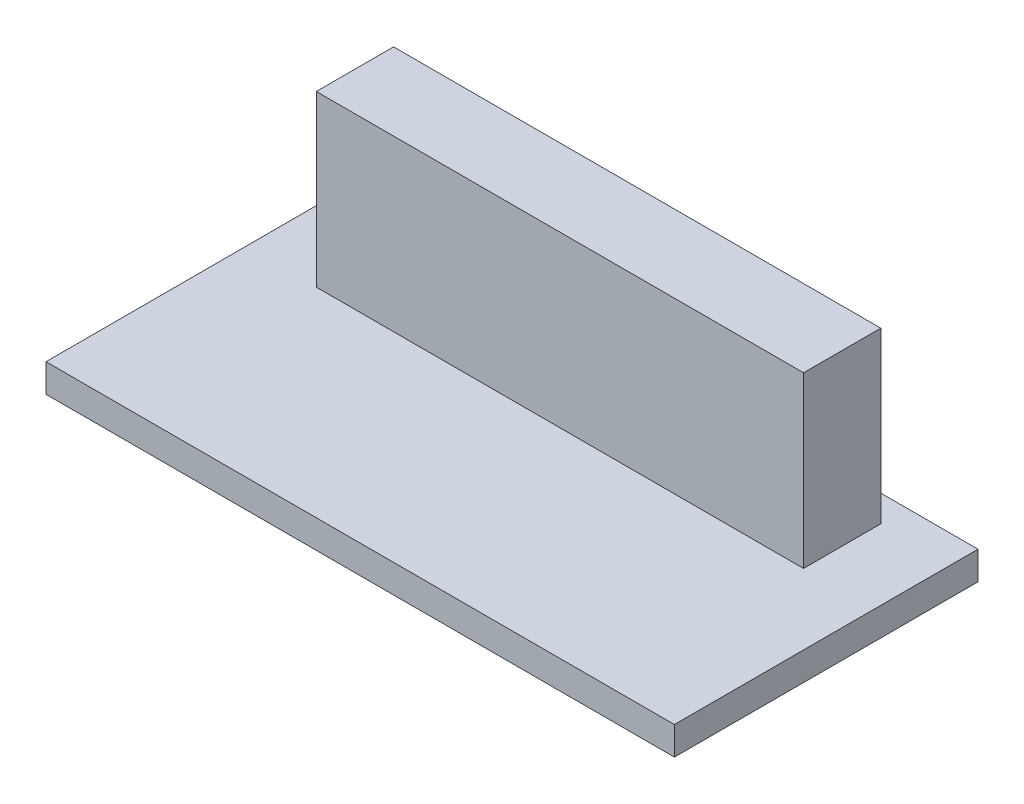
ISO-10303-21;
HEADER;
FILE_DESCRIPTION(('STEP AP214'),'2;1');
FILE_NAME('part.step','',(''),(''),'','','');
FILE_SCHEMA(('AUTOMOTIVE_DESIGN { 1 0 10303 214 1 1 1 1 }'));
ENDSEC;
DATA;
#1=APPLICATION_CONTEXT('core data for automotive mechanical design processes');
#2=APPLICATION_PROTOCOL_DEFINITION('international standard','automotive_design',2000,#1);
#3=PRODUCT_CONTEXT('',#1,'mechanical');
#4=PRODUCT('Part','Part','',(#3));
#5=PRODUCT_RELATED_PRODUCT_CATEGORY('part','',(#4));
#6=PRODUCT_DEFINITION_FORMATION('','',#4);
#7=PRODUCT_DEFINITION_CONTEXT('part definition',#1,'design');
#8=PRODUCT_DEFINITION('design','',#6,#7);
#9=PRODUCT_DEFINITION_SHAPE('','',#8);
#10=(LENGTH_UNIT() NAMED_UNIT(*) SI_UNIT(.MILLI.,.METRE.));
#11=(NAMED_UNIT(*) PLANE_ANGLE_UNIT() SI_UNIT($,.RADIAN.));
#12=(NAMED_UNIT(*) SI_UNIT($,.STERADIAN.) SOLID_ANGLE_UNIT());
#13=UNCERTAINTY_MEASURE_WITH_UNIT(LENGTH_MEASURE(1.E-05),#10,'distance_accuracy_value','');
#14=(GEOMETRIC_REPRESENTATION_CONTEXT(3) GLOBAL_UNCERTAINTY_ASSIGNED_CONTEXT((#13)) GLOBAL_UNIT_ASSIGNED_CONTEXT((#10,
#11,#12)) REPRESENTATION_CONTEXT('',''));
#15=CARTESIAN_POINT('',(0.,0.,0.));
#16=DIRECTION('',(0.,0.,1.));
#17=DIRECTION('',(1.,0.,0.));
#18=AXIS2_PLACEMENT_3D('',#15,#16,#17);
#19=CARTESIAN_POINT('',(0.,2.,0.));
#20=DIRECTION('',(0.,-1.,0.));
#21=DIRECTION('',(0.,0.,-1.));
#22=AXIS2_PLACEMENT_3D('',#19,#20,#21);
#23=PLANE('',#22);
#24=DIRECTION('',(0.,0.,-1.));
#25=VECTOR('',#24,1.);
#26=CARTESIAN_POINT('',(22.25,2.,10.75));
#27=LINE('',#26,#25);
#28=CARTESIAN_POINT('',(22.25,2.,10.75));
#29=VERTEX_POINT('',#28);
#30=CARTESIAN_POINT('',(22.25,2.,-10.75));
#31=VERTEX_POINT('',#30);
#32=EDGE_CURVE('E128',#29,#31,#27,.T.);
#33=ORIENTED_EDGE('',*,*,#32,.T.);
#34=DIRECTION('',(-1.,0.,0.));
#35=VECTOR('',#34,1.);
#36=CARTESIAN_POINT('',(-22.25,2.,-10.75));
#37=LINE('',#36,#35);
#38=CARTESIAN_POINT('',(-22.25,2.,-10.75));
#39=VERTEX_POINT('',#38);
#40=EDGE_CURVE('E131',#31,#39,#37,.T.);
#41=ORIENTED_EDGE('',*,*,#40,.T.);
#42=DIRECTION('',(0.,0.,1.));
#43=VECTOR('',#42,1.);
#44=CARTESIAN_POINT('',(-22.25,2.,10.75));
#45=LINE('',#44,#43);
#46=CARTESIAN_POINT('',(-22.25,2.,10.75));
#47=VERTEX_POINT('',#46);
#48=EDGE_CURVE('E134',#39,#47,#45,.T.);
#49=ORIENTED_EDGE('',*,*,#48,.T.);
#50=DIRECTION('',(1.,0.,0.));
#51=VECTOR('',#50,1.);
#52=CARTESIAN_POINT('',(-22.25,2.,10.75));
#53=LINE('',#52,#51);
#54=EDGE_CURVE('E136',#47,#29,#53,.T.);
#55=ORIENTED_EDGE('',*,*,#54,.T.);
#56=EDGE_LOOP('',(#33,#41,#49,#55));
#57=FACE_BOUND('',#56,.T.);
#58=DIRECTION('',(0.,0.,-1.));
#59=VECTOR('',#58,1.);
#60=CARTESIAN_POINT('',(17.2506231913385,2.,-8.86526866536673));
#61=LINE('',#60,#59);
#62=CARTESIAN_POINT('',(17.2506231913385,2.,-3.39465661527781));
#63=VERTEX_POINT('',#62);
#64=CARTESIAN_POINT('',(17.2506231913385,2.,-8.86526866536673));
#65=VERTEX_POINT('',#64);
#66=EDGE_CURVE('E118',#63,#65,#61,.T.);
#67=ORIENTED_EDGE('',*,*,#66,.F.);
#68=DIRECTION('',(1.,0.,0.));
#69=VECTOR('',#68,1.);
#70=CARTESIAN_POINT('',(-17.2506231913385,2.,-3.39465661527781));
#71=LINE('',#70,#69);
#72=CARTESIAN_POINT('',(-17.2506231913385,2.,-3.39465661527781));
#73=VERTEX_POINT('',#72);
#74=EDGE_CURVE('E115',#73,#63,#71,.T.);
#75=ORIENTED_EDGE('',*,*,#74,.F.);
#76=DIRECTION('',(0.,0.,1.));
#77=VECTOR('',#76,1.);
#78=CARTESIAN_POINT('',(-17.2506231913385,2.,-8.86526866536673));
#79=LINE('',#78,#77);
#80=CARTESIAN_POINT('',(-17.2506231913385,2.,-8.86526866536673));
#81=VERTEX_POINT('',#80);
#82=EDGE_CURVE('E53',#81,#73,#79,.T.);
#83=ORIENTED_EDGE('',*,*,#82,.F.);
#84=DIRECTION('',(-1.,0.,0.));
#85=VECTOR('',#84,1.);
#86=CARTESIAN_POINT('',(-17.2506231913385,2.,-8.86526866536673));
#87=LINE('',#86,#85);
#88=EDGE_CURVE('E48',#65,#81,#87,.T.);
#89=ORIENTED_EDGE('',*,*,#88,.F.);
#90=EDGE_LOOP('',(#67,#75,#83,#89));
#91=FACE_BOUND('',#90,.T.);
#92=ADVANCED_FACE('F33',(#57,#91),#23,.F.);
#93=CARTESIAN_POINT('',(22.25,2.,10.75));
#94=DIRECTION('',(-1.,0.,0.));
#95=DIRECTION('',(0.,0.,1.));
#96=AXIS2_PLACEMENT_3D('',#93,#94,#95);
#97=PLANE('',#96);
#98=DIRECTION('',(0.,0.,-1.));
#99=VECTOR('',#98,1.);
#100=CARTESIAN_POINT('',(22.25,0.,10.75));
#101=LINE('',#100,#99);
#102=CARTESIAN_POINT('',(22.25,0.,10.75));
#103=VERTEX_POINT('',#102);
#104=CARTESIAN_POINT('',(22.25,0.,-10.75));
#105=VERTEX_POINT('',#104);
#106=EDGE_CURVE('E119',#103,#105,#101,.T.);
#107=ORIENTED_EDGE('',*,*,#106,.T.);
#108=DIRECTION('',(0.,-1.,0.));
#109=VECTOR('',#108,1.);
#110=CARTESIAN_POINT('',(22.25,2.,-10.75));
#111=LINE('',#110,#109);
#112=EDGE_CURVE('E11',#31,#105,#111,.T.);
#113=ORIENTED_EDGE('',*,*,#112,.F.);
#114=ORIENTED_EDGE('',*,*,#32,.F.);
#115=DIRECTION('',(0.,-1.,0.));
#116=VECTOR('',#115,1.);
#117=CARTESIAN_POINT('',(22.25,2.,10.75));
#118=LINE('',#117,#116);
#119=EDGE_CURVE('E137',#29,#103,#118,.T.);
#120=ORIENTED_EDGE('',*,*,#119,.T.);
#121=EDGE_LOOP('',(#107,#113,#114,#120));
#122=FACE_BOUND('',#121,.T.);
#123=ADVANCED_FACE('F35',(#122),#97,.F.);
#124=CARTESIAN_POINT('',(-22.25,2.,-10.75));
#125=DIRECTION('',(0.,0.,1.));
#126=DIRECTION('',(1.,0.,0.));
#127=AXIS2_PLACEMENT_3D('',#124,#125,#126);
#128=PLANE('',#127);
#129=DIRECTION('',(-1.,0.,0.));
#130=VECTOR('',#129,1.);
#131=CARTESIAN_POINT('',(-22.25,0.,-10.75));
#132=LINE('',#131,#130);
#133=CARTESIAN_POINT('',(-22.25,0.,-10.75));
#134=VERTEX_POINT('',#133);
#135=EDGE_CURVE('E122',#105,#134,#132,.T.);
#136=ORIENTED_EDGE('',*,*,#135,.T.);
#137=DIRECTION('',(0.,-1.,0.));
#138=VECTOR('',#137,1.);
#139=CARTESIAN_POINT('',(-22.25,2.,-10.75));
#140=LINE('',#139,#138);
#141=EDGE_CURVE('E41',#39,#134,#140,.T.);
#142=ORIENTED_EDGE('',*,*,#141,.F.);
#143=ORIENTED_EDGE('',*,*,#40,.F.);
#144=ORIENTED_EDGE('',*,*,#112,.T.);
#145=EDGE_LOOP('',(#136,#142,#143,#144));
#146=FACE_BOUND('',#145,.T.);
#147=ADVANCED_FACE('F167',(#146),#128,.F.);
#148=CARTESIAN_POINT('',(-22.25,2.,10.75));
#149=DIRECTION('',(1.,0.,0.));
#150=DIRECTION('',(0.,0.,-1.));
#151=AXIS2_PLACEMENT_3D('',#148,#149,#150);
#152=PLANE('',#151);
#153=DIRECTION('',(0.,0.,1.));
#154=VECTOR('',#153,1.);
#155=CARTESIAN_POINT('',(-22.25,0.,10.75));
#156=LINE('',#155,#154);
#157=CARTESIAN_POINT('',(-22.25,0.,10.75));
#158=VERTEX_POINT('',#157);
#159=EDGE_CURVE('E140',#134,#158,#156,.T.);
#160=ORIENTED_EDGE('',*,*,#159,.T.);
#161=DIRECTION('',(0.,-1.,0.));
#162=VECTOR('',#161,1.);
#163=CARTESIAN_POINT('',(-22.25,2.,10.75));
#164=LINE('',#163,#162);
#165=EDGE_CURVE('E145',#47,#158,#164,.T.);
#166=ORIENTED_EDGE('',*,*,#165,.F.);
#167=ORIENTED_EDGE('',*,*,#48,.F.);
#168=ORIENTED_EDGE('',*,*,#141,.T.);
#169=EDGE_LOOP('',(#160,#166,#167,#168));
#170=FACE_BOUND('',#169,.T.);
#171=ADVANCED_FACE('F152',(#170),#152,.F.);
#172=CARTESIAN_POINT('',(-22.25,2.,10.75));
#173=DIRECTION('',(0.,0.,-1.));
#174=DIRECTION('',(-1.,0.,0.));
#175=AXIS2_PLACEMENT_3D('',#172,#173,#174);
#176=PLANE('',#175);
#177=DIRECTION('',(1.,0.,0.));
#178=VECTOR('',#177,1.);
#179=CARTESIAN_POINT('',(-22.25,0.,10.75));
#180=LINE('',#179,#178);
#181=EDGE_CURVE('E132',#158,#103,#180,.T.);
#182=ORIENTED_EDGE('',*,*,#181,.T.);
#183=ORIENTED_EDGE('',*,*,#119,.F.);
#184=ORIENTED_EDGE('',*,*,#54,.F.);
#185=ORIENTED_EDGE('',*,*,#165,.T.);
#186=EDGE_LOOP('',(#182,#183,#184,#185));
#187=FACE_BOUND('',#186,.T.);
#188=ADVANCED_FACE('F161',(#187),#176,.F.);
#189=CARTESIAN_POINT('',(0.,0.,0.));
#190=DIRECTION('',(0.,-1.,0.));
#191=DIRECTION('',(0.,0.,-1.));
#192=AXIS2_PLACEMENT_3D('',#189,#190,#191);
#193=PLANE('',#192);
#194=ORIENTED_EDGE('',*,*,#106,.F.);
#195=ORIENTED_EDGE('',*,*,#181,.F.);
#196=ORIENTED_EDGE('',*,*,#159,.F.);
#197=ORIENTED_EDGE('',*,*,#135,.F.);
#198=EDGE_LOOP('',(#194,#195,#196,#197));
#199=FACE_BOUND('',#198,.T.);
#200=ADVANCED_FACE('F158',(#199),#193,.T.);
#201=CARTESIAN_POINT('',(17.2506231913385,14.,-8.86526866536673));
#202=DIRECTION('',(-1.,0.,0.));
#203=DIRECTION('',(0.,0.,1.));
#204=AXIS2_PLACEMENT_3D('',#201,#202,#203);
#205=PLANE('',#204);
#206=ORIENTED_EDGE('',*,*,#66,.T.);
#207=DIRECTION('',(0.,-1.,0.));
#208=VECTOR('',#207,1.);
#209=CARTESIAN_POINT('',(17.2506231913385,14.,-8.86526866536673));
#210=LINE('',#209,#208);
#211=CARTESIAN_POINT('',(17.2506231913385,14.,-8.86526866536673));
#212=VERTEX_POINT('',#211);
#213=EDGE_CURVE('E99',#212,#65,#210,.T.);
#214=ORIENTED_EDGE('',*,*,#213,.F.);
#215=DIRECTION('',(0.,0.,-1.));
#216=VECTOR('',#215,1.);
#217=CARTESIAN_POINT('',(17.2506231913385,14.,-8.86526866536673));
#218=LINE('',#217,#216);
#219=CARTESIAN_POINT('',(17.2506231913385,14.,-3.39465661527781));
#220=VERTEX_POINT('',#219);
#221=EDGE_CURVE('E106',#220,#212,#218,.T.);
#222=ORIENTED_EDGE('',*,*,#221,.F.);
#223=DIRECTION('',(0.,-1.,0.));
#224=VECTOR('',#223,1.);
#225=CARTESIAN_POINT('',(17.2506231913385,14.,-3.39465661527781));
#226=LINE('',#225,#224);
#227=EDGE_CURVE('E260',#220,#63,#226,.T.);
#228=ORIENTED_EDGE('',*,*,#227,.T.);
#229=EDGE_LOOP('',(#206,#214,#222,#228));
#230=FACE_BOUND('',#229,.T.);
#231=ADVANCED_FACE('F117',(#230),#205,.F.);
#232=CARTESIAN_POINT('',(-17.2506231913385,14.,-8.86526866536673));
#233=DIRECTION('',(0.,0.,1.));
#234=DIRECTION('',(1.,0.,0.));
#235=AXIS2_PLACEMENT_3D('',#232,#233,#234);
#236=PLANE('',#235);
#237=ORIENTED_EDGE('',*,*,#88,.T.);
#238=DIRECTION('',(0.,-1.,0.));
#239=VECTOR('',#238,1.);
#240=CARTESIAN_POINT('',(-17.2506231913385,14.,-8.86526866536673));
#241=LINE('',#240,#239);
#242=CARTESIAN_POINT('',(-17.2506231913385,14.,-8.86526866536673));
#243=VERTEX_POINT('',#242);
#244=EDGE_CURVE('E102',#243,#81,#241,.T.);
#245=ORIENTED_EDGE('',*,*,#244,.F.);
#246=DIRECTION('',(-1.,0.,0.));
#247=VECTOR('',#246,1.);
#248=CARTESIAN_POINT('',(-17.2506231913385,14.,-8.86526866536673));
#249=LINE('',#248,#247);
#250=EDGE_CURVE('E95',#212,#243,#249,.T.);
#251=ORIENTED_EDGE('',*,*,#250,.F.);
#252=ORIENTED_EDGE('',*,*,#213,.T.);
#253=EDGE_LOOP('',(#237,#245,#251,#252));
#254=FACE_BOUND('',#253,.T.);
#255=ADVANCED_FACE('F97',(#254),#236,.F.);
#256=CARTESIAN_POINT('',(-17.2506231913385,14.,-8.86526866536673));
#257=DIRECTION('',(1.,0.,0.));
#258=DIRECTION('',(0.,0.,-1.));
#259=AXIS2_PLACEMENT_3D('',#256,#257,#258);
#260=PLANE('',#259);
#261=ORIENTED_EDGE('',*,*,#82,.T.);
#262=DIRECTION('',(0.,-1.,0.));
#263=VECTOR('',#262,1.);
#264=CARTESIAN_POINT('',(-17.2506231913385,14.,-3.39465661527781));
#265=LINE('',#264,#263);
#266=CARTESIAN_POINT('',(-17.2506231913385,14.,-3.39465661527781));
#267=VERTEX_POINT('',#266);
#268=EDGE_CURVE('E124',#267,#73,#265,.T.);
#269=ORIENTED_EDGE('',*,*,#268,.F.);
#270=DIRECTION('',(0.,0.,1.));
#271=VECTOR('',#270,1.);
#272=CARTESIAN_POINT('',(-17.2506231913385,14.,-8.86526866536673));
#273=LINE('',#272,#271);
#274=EDGE_CURVE('E105',#243,#267,#273,.T.);
#275=ORIENTED_EDGE('',*,*,#274,.F.);
#276=ORIENTED_EDGE('',*,*,#244,.T.);
#277=EDGE_LOOP('',(#261,#269,#275,#276));
#278=FACE_BOUND('',#277,.T.);
#279=ADVANCED_FACE('F203',(#278),#260,.F.);
#280=CARTESIAN_POINT('',(-17.2506231913385,14.,-3.39465661527781));
#281=DIRECTION('',(0.,0.,-1.));
#282=DIRECTION('',(-1.,0.,0.));
#283=AXIS2_PLACEMENT_3D('',#280,#281,#282);
#284=PLANE('',#283);
#285=ORIENTED_EDGE('',*,*,#74,.T.);
#286=ORIENTED_EDGE('',*,*,#227,.F.);
#287=DIRECTION('',(1.,0.,0.));
#288=VECTOR('',#287,1.);
#289=CARTESIAN_POINT('',(-17.2506231913385,14.,-3.39465661527781));
#290=LINE('',#289,#288);
#291=EDGE_CURVE('E111',#267,#220,#290,.T.);
#292=ORIENTED_EDGE('',*,*,#291,.F.);
#293=ORIENTED_EDGE('',*,*,#268,.T.);
#294=EDGE_LOOP('',(#285,#286,#292,#293));
#295=FACE_BOUND('',#294,.T.);
#296=ADVANCED_FACE('F209',(#295),#284,.F.);
#297=CARTESIAN_POINT('',(0.,14.,0.));
#298=DIRECTION('',(0.,1.,0.));
#299=DIRECTION('',(0.,0.,1.));
#300=AXIS2_PLACEMENT_3D('',#297,#298,#299);
#301=PLANE('',#300);
#302=ORIENTED_EDGE('',*,*,#221,.T.);
#303=ORIENTED_EDGE('',*,*,#250,.T.);
#304=ORIENTED_EDGE('',*,*,#274,.T.);
#305=ORIENTED_EDGE('',*,*,#291,.T.);
#306=EDGE_LOOP('',(#302,#303,#304,#305));
#307=FACE_BOUND('',#306,.T.);
#308=ADVANCED_FACE('F109',(#307),#301,.T.);
#309=CLOSED_SHELL('',(#92,#123,#147,#171,#188,#200,#231,#255,#279,#296,#308));
#310=MANIFOLD_SOLID_BREP('B2',#309);
#311=ADVANCED_BREP_SHAPE_REPRESENTATION('',(#18,#310),#14);
#312=SHAPE_DEFINITION_REPRESENTATION(#9,#311);
ENDSEC;
END-ISO-10303-21;
